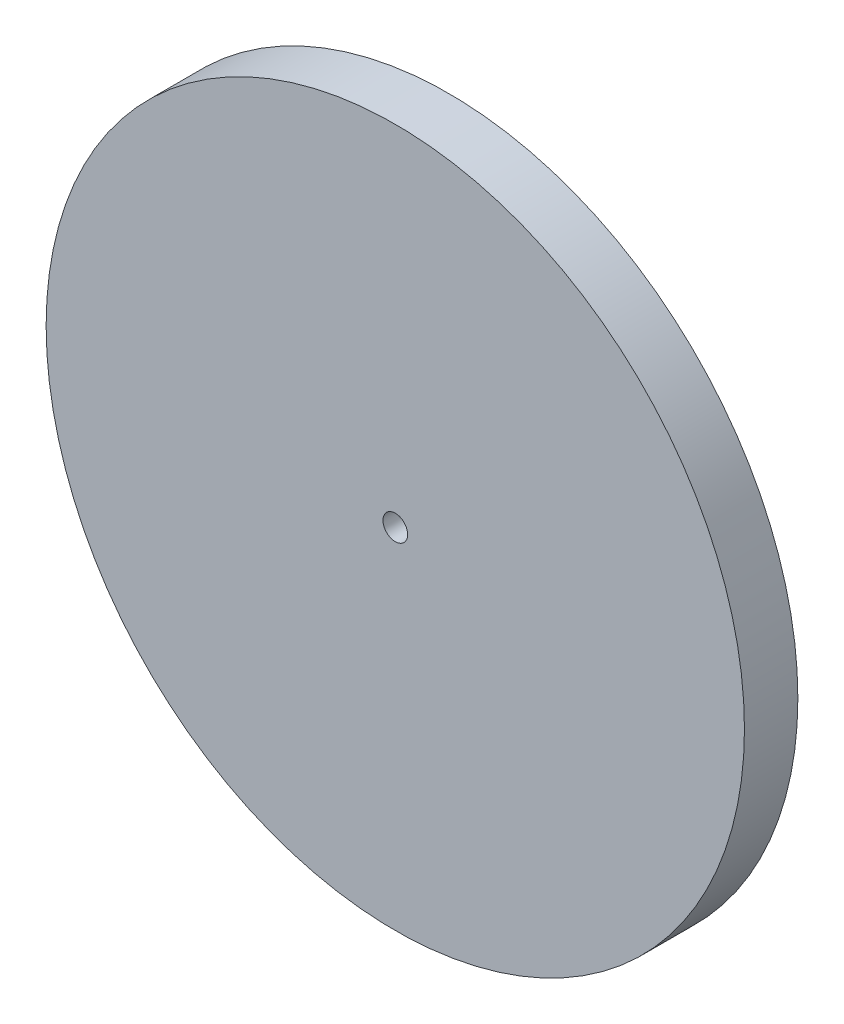
ISO-10303-21;
HEADER;
FILE_DESCRIPTION(('STEP AP214'),'2;1');
FILE_NAME('part.step','',(''),(''),'','','');
FILE_SCHEMA(('AUTOMOTIVE_DESIGN { 1 0 10303 214 1 1 1 1 }'));
ENDSEC;
DATA;
#1=APPLICATION_CONTEXT('core data for automotive mechanical design processes');
#2=APPLICATION_PROTOCOL_DEFINITION('international standard','automotive_design',2000,#1);
#3=PRODUCT_CONTEXT('',#1,'mechanical');
#4=PRODUCT('Part','Part','',(#3));
#5=PRODUCT_RELATED_PRODUCT_CATEGORY('part','',(#4));
#6=PRODUCT_DEFINITION_FORMATION('','',#4);
#7=PRODUCT_DEFINITION_CONTEXT('part definition',#1,'design');
#8=PRODUCT_DEFINITION('design','',#6,#7);
#9=PRODUCT_DEFINITION_SHAPE('','',#8);
#10=(LENGTH_UNIT() NAMED_UNIT(*) SI_UNIT(.MILLI.,.METRE.));
#11=(NAMED_UNIT(*) PLANE_ANGLE_UNIT() SI_UNIT($,.RADIAN.));
#12=(NAMED_UNIT(*) SI_UNIT($,.STERADIAN.) SOLID_ANGLE_UNIT());
#13=UNCERTAINTY_MEASURE_WITH_UNIT(LENGTH_MEASURE(1.E-05),#10,'distance_accuracy_value','');
#14=(GEOMETRIC_REPRESENTATION_CONTEXT(3) GLOBAL_UNCERTAINTY_ASSIGNED_CONTEXT((#13)) GLOBAL_UNIT_ASSIGNED_CONTEXT((#10,
#11,#12)) REPRESENTATION_CONTEXT('',''));
#15=CARTESIAN_POINT('',(0.,0.,0.));
#16=DIRECTION('',(0.,0.,1.));
#17=DIRECTION('',(1.,0.,0.));
#18=AXIS2_PLACEMENT_3D('',#15,#16,#17);
#19=CARTESIAN_POINT('',(0.,0.,6.5));
#20=DIRECTION('',(0.,0.,-1.));
#21=DIRECTION('',(-1.,0.,0.));
#22=AXIS2_PLACEMENT_3D('',#19,#20,#21);
#23=CYLINDRICAL_SURFACE('',#22,42.5);
#24=CARTESIAN_POINT('',(0.,0.,6.5));
#25=DIRECTION('',(0.,0.,1.));
#26=DIRECTION('',(1.,0.,0.));
#27=AXIS2_PLACEMENT_3D('',#24,#25,#26);
#28=CIRCLE('',#27,42.5);
#29=CARTESIAN_POINT('',(-42.5,0.,6.5));
#30=VERTEX_POINT('',#29);
#31=EDGE_CURVE('E10',#30,#30,#28,.T.);
#32=CARTESIAN_POINT('',(0.,0.,0.));
#33=DIRECTION('',(0.,0.,1.));
#34=DIRECTION('',(1.,0.,0.));
#35=AXIS2_PLACEMENT_3D('',#32,#33,#34);
#36=CIRCLE('',#35,42.5);
#37=CARTESIAN_POINT('',(-42.5,0.,0.));
#38=VERTEX_POINT('',#37);
#39=EDGE_CURVE('E35',#38,#38,#36,.T.);
#40=CARTESIAN_POINT('',(-42.5,0.,6.5));
#41=CARTESIAN_POINT('',(-42.5,0.,6.43229166666667));
#42=CARTESIAN_POINT('',(-42.5,0.,6.36458333333333));
#43=CARTESIAN_POINT('',(-42.5,0.,6.22916666666667));
#44=CARTESIAN_POINT('',(-42.5,0.,6.16145833333333));
#45=CARTESIAN_POINT('',(-42.5,0.,6.02604166666667));
#46=CARTESIAN_POINT('',(-42.5,0.,5.95833333333333));
#47=CARTESIAN_POINT('',(-42.5,0.,5.82291666666667));
#48=CARTESIAN_POINT('',(-42.5,0.,5.75520833333333));
#49=CARTESIAN_POINT('',(-42.5,0.,5.61979166666667));
#50=CARTESIAN_POINT('',(-42.5,0.,5.55208333333333));
#51=CARTESIAN_POINT('',(-42.5,0.,5.41666666666667));
#52=CARTESIAN_POINT('',(-42.5,0.,5.34895833333333));
#53=CARTESIAN_POINT('',(-42.5,0.,5.21354166666667));
#54=CARTESIAN_POINT('',(-42.5,0.,5.14583333333333));
#55=CARTESIAN_POINT('',(-42.5,0.,5.01041666666667));
#56=CARTESIAN_POINT('',(-42.5,0.,4.94270833333333));
#57=CARTESIAN_POINT('',(-42.5,0.,4.80729166666667));
#58=CARTESIAN_POINT('',(-42.5,0.,4.73958333333333));
#59=CARTESIAN_POINT('',(-42.5,0.,4.60416666666667));
#60=CARTESIAN_POINT('',(-42.5,0.,4.53645833333333));
#61=CARTESIAN_POINT('',(-42.5,0.,4.40104166666667));
#62=CARTESIAN_POINT('',(-42.5,0.,4.33333333333333));
#63=CARTESIAN_POINT('',(-42.5,0.,4.19791666666667));
#64=CARTESIAN_POINT('',(-42.5,0.,4.13020833333333));
#65=CARTESIAN_POINT('',(-42.5,0.,3.99479166666667));
#66=CARTESIAN_POINT('',(-42.5,0.,3.92708333333333));
#67=CARTESIAN_POINT('',(-42.5,0.,3.79166666666667));
#68=CARTESIAN_POINT('',(-42.5,0.,3.72395833333333));
#69=CARTESIAN_POINT('',(-42.5,0.,3.58854166666667));
#70=CARTESIAN_POINT('',(-42.5,0.,3.52083333333333));
#71=CARTESIAN_POINT('',(-42.5,0.,3.38541666666667));
#72=CARTESIAN_POINT('',(-42.5,0.,3.31770833333333));
#73=CARTESIAN_POINT('',(-42.5,0.,3.18229166666667));
#74=CARTESIAN_POINT('',(-42.5,0.,3.11458333333333));
#75=CARTESIAN_POINT('',(-42.5,0.,2.97916666666667));
#76=CARTESIAN_POINT('',(-42.5,0.,2.91145833333333));
#77=CARTESIAN_POINT('',(-42.5,0.,2.77604166666667));
#78=CARTESIAN_POINT('',(-42.5,0.,2.70833333333333));
#79=CARTESIAN_POINT('',(-42.5,0.,2.57291666666667));
#80=CARTESIAN_POINT('',(-42.5,0.,2.50520833333333));
#81=CARTESIAN_POINT('',(-42.5,0.,2.36979166666667));
#82=CARTESIAN_POINT('',(-42.5,0.,2.30208333333333));
#83=CARTESIAN_POINT('',(-42.5,0.,2.16666666666667));
#84=CARTESIAN_POINT('',(-42.5,0.,2.09895833333333));
#85=CARTESIAN_POINT('',(-42.5,0.,1.96354166666667));
#86=CARTESIAN_POINT('',(-42.5,0.,1.89583333333333));
#87=CARTESIAN_POINT('',(-42.5,0.,1.76041666666667));
#88=CARTESIAN_POINT('',(-42.5,0.,1.69270833333333));
#89=CARTESIAN_POINT('',(-42.5,0.,1.55729166666667));
#90=CARTESIAN_POINT('',(-42.5,0.,1.48958333333333));
#91=CARTESIAN_POINT('',(-42.5,0.,1.35416666666667));
#92=CARTESIAN_POINT('',(-42.5,0.,1.28645833333333));
#93=CARTESIAN_POINT('',(-42.5,0.,1.15104166666667));
#94=CARTESIAN_POINT('',(-42.5,0.,1.08333333333333));
#95=CARTESIAN_POINT('',(-42.5,0.,0.947916666666667));
#96=CARTESIAN_POINT('',(-42.5,0.,0.880208333333333));
#97=CARTESIAN_POINT('',(-42.5,0.,0.744791666666667));
#98=CARTESIAN_POINT('',(-42.5,0.,0.677083333333333));
#99=CARTESIAN_POINT('',(-42.5,0.,0.541666666666667));
#100=CARTESIAN_POINT('',(-42.5,0.,0.473958333333333));
#101=CARTESIAN_POINT('',(-42.5,0.,0.338541666666667));
#102=CARTESIAN_POINT('',(-42.5,0.,0.270833333333334));
#103=CARTESIAN_POINT('',(-42.5,0.,0.135416666666667));
#104=CARTESIAN_POINT('',(-42.5,0.,0.0677083333333334));
#105=CARTESIAN_POINT('',(-42.5,0.,0.));
#106=B_SPLINE_CURVE_WITH_KNOTS('',3,(#40,#41,#42,#43,#44,#45,#46,#47,#48,#49,#50,#51,#52,#53,
#54,#55,#56,#57,#58,#59,#60,#61,#62,#63,#64,#65,#66,#67,#68,#69,#70,#71,#72,#73,#74,#75,#76,#77,
#78,#79,#80,#81,#82,#83,#84,#85,#86,#87,#88,#89,#90,#91,#92,#93,#94,#95,#96,#97,#98,#99,#100,
#101,#102,#103,#104,#105),.UNSPECIFIED.,.F.,.F.,(4,2,2,2,2,2,2,2,2,2,2,2,2,2,2,2,2,2,2,2,2,2,2,
2,2,2,2,2,2,2,2,2,4),(0.,0.203125,0.40625,0.609375000000001,0.812500000000001,1.015625,1.21875,
1.421875,1.625,1.828125,2.03125,2.234375,2.4375,2.640625,2.84375,3.046875,3.25,3.453125,3.65625,
3.859375,4.0625,4.265625,4.46875,4.671875,4.875,5.078125,5.28125,5.484375,5.6875,5.890625,
6.09375,6.296875,6.5),.UNSPECIFIED.);
#107=EDGE_CURVE('BSEAM32',#30,#38,#106,.T.);
#108=ORIENTED_EDGE('',*,*,#31,.F.);
#109=ORIENTED_EDGE('',*,*,#39,.T.);
#110=ORIENTED_EDGE('',*,*,#107,.T.);
#111=ORIENTED_EDGE('',*,*,#107,.F.);
#112=EDGE_LOOP('',(#108,#110,#109,#111));
#113=FACE_BOUND('',#112,.T.);
#114=ADVANCED_FACE('F32',(#113),#23,.T.);
#115=CARTESIAN_POINT('',(0.,0.,6.5));
#116=DIRECTION('',(0.,0.,1.));
#117=DIRECTION('',(1.,0.,0.));
#118=AXIS2_PLACEMENT_3D('',#115,#116,#117);
#119=PLANE('',#118);
#120=CARTESIAN_POINT('',(0.,0.,6.5));
#121=DIRECTION('',(0.,0.,1.));
#122=DIRECTION('',(1.,0.,0.));
#123=AXIS2_PLACEMENT_3D('',#120,#121,#122);
#124=CIRCLE('',#123,1.5);
#125=CARTESIAN_POINT('',(1.5,0.,6.5));
#126=VERTEX_POINT('',#125);
#127=EDGE_CURVE('E42',#126,#126,#124,.T.);
#128=ORIENTED_EDGE('',*,*,#127,.F.);
#129=EDGE_LOOP('',(#128));
#130=FACE_BOUND('',#129,.T.);
#131=ORIENTED_EDGE('',*,*,#31,.T.);
#132=EDGE_LOOP('',(#131));
#133=FACE_BOUND('',#132,.T.);
#134=ADVANCED_FACE('F60',(#130,#133),#119,.T.);
#135=CARTESIAN_POINT('',(0.,0.,0.));
#136=DIRECTION('',(0.,0.,1.));
#137=DIRECTION('',(1.,0.,0.));
#138=AXIS2_PLACEMENT_3D('',#135,#136,#137);
#139=PLANE('',#138);
#140=CARTESIAN_POINT('',(0.,0.,0.));
#141=DIRECTION('',(0.,0.,1.));
#142=DIRECTION('',(1.,0.,0.));
#143=AXIS2_PLACEMENT_3D('',#140,#141,#142);
#144=CIRCLE('',#143,1.5);
#145=CARTESIAN_POINT('',(1.5,0.,0.));
#146=VERTEX_POINT('',#145);
#147=EDGE_CURVE('E46',#146,#146,#144,.T.);
#148=ORIENTED_EDGE('',*,*,#147,.T.);
#149=EDGE_LOOP('',(#148));
#150=FACE_BOUND('',#149,.T.);
#151=ORIENTED_EDGE('',*,*,#39,.F.);
#152=EDGE_LOOP('',(#151));
#153=FACE_BOUND('',#152,.T.);
#154=ADVANCED_FACE('F50',(#150,#153),#139,.F.);
#155=CARTESIAN_POINT('',(0.,0.,0.));
#156=DIRECTION('',(0.,0.,1.));
#157=DIRECTION('',(1.,0.,0.));
#158=AXIS2_PLACEMENT_3D('',#155,#156,#157);
#159=CYLINDRICAL_SURFACE('',#158,1.5);
#160=CARTESIAN_POINT('',(1.5,0.,6.5));
#161=CARTESIAN_POINT('',(1.5,0.,6.43229166666667));
#162=CARTESIAN_POINT('',(1.5,0.,6.36458333333333));
#163=CARTESIAN_POINT('',(1.5,0.,6.22916666666667));
#164=CARTESIAN_POINT('',(1.5,0.,6.16145833333333));
#165=CARTESIAN_POINT('',(1.5,0.,6.02604166666667));
#166=CARTESIAN_POINT('',(1.5,0.,5.95833333333333));
#167=CARTESIAN_POINT('',(1.5,0.,5.82291666666667));
#168=CARTESIAN_POINT('',(1.5,0.,5.75520833333333));
#169=CARTESIAN_POINT('',(1.5,0.,5.61979166666667));
#170=CARTESIAN_POINT('',(1.5,0.,5.55208333333333));
#171=CARTESIAN_POINT('',(1.5,0.,5.41666666666667));
#172=CARTESIAN_POINT('',(1.5,0.,5.34895833333333));
#173=CARTESIAN_POINT('',(1.5,0.,5.21354166666667));
#174=CARTESIAN_POINT('',(1.5,0.,5.14583333333333));
#175=CARTESIAN_POINT('',(1.5,0.,5.01041666666667));
#176=CARTESIAN_POINT('',(1.5,0.,4.94270833333333));
#177=CARTESIAN_POINT('',(1.5,0.,4.80729166666667));
#178=CARTESIAN_POINT('',(1.5,0.,4.73958333333333));
#179=CARTESIAN_POINT('',(1.5,0.,4.60416666666667));
#180=CARTESIAN_POINT('',(1.5,0.,4.53645833333333));
#181=CARTESIAN_POINT('',(1.5,0.,4.40104166666667));
#182=CARTESIAN_POINT('',(1.5,0.,4.33333333333333));
#183=CARTESIAN_POINT('',(1.5,0.,4.19791666666667));
#184=CARTESIAN_POINT('',(1.5,0.,4.13020833333333));
#185=CARTESIAN_POINT('',(1.5,0.,3.99479166666667));
#186=CARTESIAN_POINT('',(1.5,0.,3.92708333333333));
#187=CARTESIAN_POINT('',(1.5,0.,3.79166666666667));
#188=CARTESIAN_POINT('',(1.5,0.,3.72395833333333));
#189=CARTESIAN_POINT('',(1.5,0.,3.58854166666667));
#190=CARTESIAN_POINT('',(1.5,0.,3.52083333333333));
#191=CARTESIAN_POINT('',(1.5,0.,3.38541666666667));
#192=CARTESIAN_POINT('',(1.5,0.,3.31770833333333));
#193=CARTESIAN_POINT('',(1.5,0.,3.18229166666667));
#194=CARTESIAN_POINT('',(1.5,0.,3.11458333333333));
#195=CARTESIAN_POINT('',(1.5,0.,2.97916666666667));
#196=CARTESIAN_POINT('',(1.5,0.,2.91145833333333));
#197=CARTESIAN_POINT('',(1.5,0.,2.77604166666667));
#198=CARTESIAN_POINT('',(1.5,0.,2.70833333333333));
#199=CARTESIAN_POINT('',(1.5,0.,2.57291666666667));
#200=CARTESIAN_POINT('',(1.5,0.,2.50520833333333));
#201=CARTESIAN_POINT('',(1.5,0.,2.36979166666667));
#202=CARTESIAN_POINT('',(1.5,0.,2.30208333333333));
#203=CARTESIAN_POINT('',(1.5,0.,2.16666666666667));
#204=CARTESIAN_POINT('',(1.5,0.,2.09895833333333));
#205=CARTESIAN_POINT('',(1.5,0.,1.96354166666667));
#206=CARTESIAN_POINT('',(1.5,0.,1.89583333333333));
#207=CARTESIAN_POINT('',(1.5,0.,1.76041666666667));
#208=CARTESIAN_POINT('',(1.5,0.,1.69270833333333));
#209=CARTESIAN_POINT('',(1.5,0.,1.55729166666667));
#210=CARTESIAN_POINT('',(1.5,0.,1.48958333333333));
#211=CARTESIAN_POINT('',(1.5,0.,1.35416666666667));
#212=CARTESIAN_POINT('',(1.5,0.,1.28645833333333));
#213=CARTESIAN_POINT('',(1.5,0.,1.15104166666667));
#214=CARTESIAN_POINT('',(1.5,0.,1.08333333333333));
#215=CARTESIAN_POINT('',(1.5,0.,0.947916666666666));
#216=CARTESIAN_POINT('',(1.5,0.,0.880208333333333));
#217=CARTESIAN_POINT('',(1.5,0.,0.744791666666666));
#218=CARTESIAN_POINT('',(1.5,0.,0.677083333333333));
#219=CARTESIAN_POINT('',(1.5,0.,0.541666666666667));
#220=CARTESIAN_POINT('',(1.5,0.,0.473958333333333));
#221=CARTESIAN_POINT('',(1.5,0.,0.338541666666667));
#222=CARTESIAN_POINT('',(1.5,0.,0.270833333333334));
#223=CARTESIAN_POINT('',(1.5,0.,0.135416666666667));
#224=CARTESIAN_POINT('',(1.5,0.,0.0677083333333334));
#225=CARTESIAN_POINT('',(1.5,0.,0.));
#226=B_SPLINE_CURVE_WITH_KNOTS('',3,(#160,#161,#162,#163,#164,#165,#166,#167,#168,#169,#170,
#171,#172,#173,#174,#175,#176,#177,#178,#179,#180,#181,#182,#183,#184,#185,#186,#187,#188,#189,
#190,#191,#192,#193,#194,#195,#196,#197,#198,#199,#200,#201,#202,#203,#204,#205,#206,#207,#208,
#209,#210,#211,#212,#213,#214,#215,#216,#217,#218,#219,#220,#221,#222,#223,#224,#225),
.UNSPECIFIED.,.F.,.F.,(4,2,2,2,2,2,2,2,2,2,2,2,2,2,2,2,2,2,2,2,2,2,2,2,2,2,2,2,2,2,2,2,4),(0.,
0.203125,0.40625,0.609375000000001,0.8125,1.015625,1.21875,1.421875,1.625,1.828125,2.03125,
2.234375,2.4375,2.640625,2.84375,3.046875,3.25,3.453125,3.65625,3.859375,4.0625,4.265625,
4.46875,4.671875,4.875,5.078125,5.28125,5.484375,5.6875,5.890625,6.09375,6.296875,6.5),.UNSPECIFIED.);
#227=EDGE_CURVE('BSEAM53',#126,#146,#226,.T.);
#228=ORIENTED_EDGE('',*,*,#127,.T.);
#229=ORIENTED_EDGE('',*,*,#147,.F.);
#230=ORIENTED_EDGE('',*,*,#227,.T.);
#231=ORIENTED_EDGE('',*,*,#227,.F.);
#232=EDGE_LOOP('',(#228,#230,#229,#231));
#233=FACE_BOUND('',#232,.T.);
#234=ADVANCED_FACE('F53',(#233),#159,.F.);
#235=CLOSED_SHELL('',(#114,#134,#154,#234));
#236=MANIFOLD_SOLID_BREP('B2',#235);
#237=ADVANCED_BREP_SHAPE_REPRESENTATION('',(#18,#236),#14);
#238=SHAPE_DEFINITION_REPRESENTATION(#9,#237);
ENDSEC;
END-ISO-10303-21;
